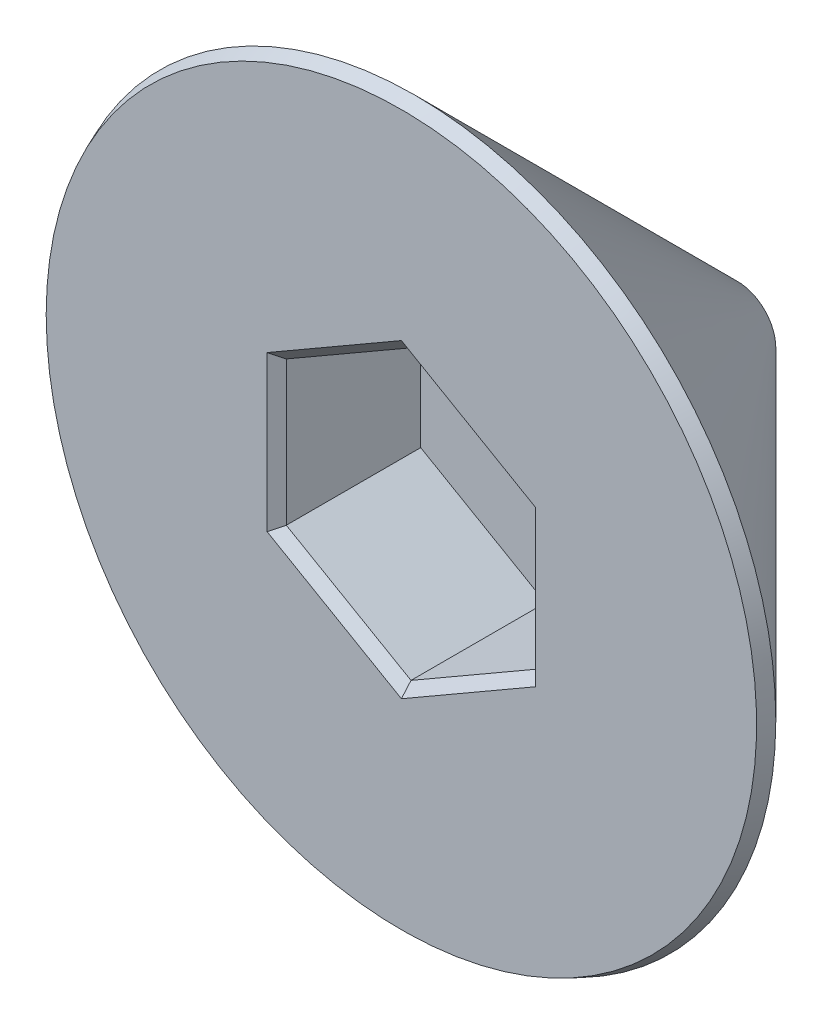
ISO-10303-21;
HEADER;
FILE_DESCRIPTION(('STEP AP214'),'2;1');
FILE_NAME('part.step','',(''),(''),'','','');
FILE_SCHEMA(('AUTOMOTIVE_DESIGN { 1 0 10303 214 1 1 1 1 }'));
ENDSEC;
DATA;
#1=APPLICATION_CONTEXT('core data for automotive mechanical design processes');
#2=APPLICATION_PROTOCOL_DEFINITION('international standard','automotive_design',2000,#1);
#3=PRODUCT_CONTEXT('',#1,'mechanical');
#4=PRODUCT('Part','Part','',(#3));
#5=PRODUCT_RELATED_PRODUCT_CATEGORY('part','',(#4));
#6=PRODUCT_DEFINITION_FORMATION('','',#4);
#7=PRODUCT_DEFINITION_CONTEXT('part definition',#1,'design');
#8=PRODUCT_DEFINITION('design','',#6,#7);
#9=PRODUCT_DEFINITION_SHAPE('','',#8);
#10=(LENGTH_UNIT() NAMED_UNIT(*) SI_UNIT(.MILLI.,.METRE.));
#11=(NAMED_UNIT(*) PLANE_ANGLE_UNIT() SI_UNIT($,.RADIAN.));
#12=(NAMED_UNIT(*) SI_UNIT($,.STERADIAN.) SOLID_ANGLE_UNIT());
#13=UNCERTAINTY_MEASURE_WITH_UNIT(LENGTH_MEASURE(1.E-05),#10,'distance_accuracy_value','');
#14=(GEOMETRIC_REPRESENTATION_CONTEXT(3) GLOBAL_UNCERTAINTY_ASSIGNED_CONTEXT((#13)) GLOBAL_UNIT_ASSIGNED_CONTEXT((#10,
#11,#12)) REPRESENTATION_CONTEXT('',''));
#15=CARTESIAN_POINT('',(0.,0.,0.));
#16=DIRECTION('',(0.,0.,1.));
#17=DIRECTION('',(1.,0.,0.));
#18=AXIS2_PLACEMENT_3D('',#15,#16,#17);
#19=CARTESIAN_POINT('',(-7.5,-14.4903810567666,66.5));
#20=DIRECTION('',(0.,0.,-1.));
#21=DIRECTION('',(-1.,0.,0.));
#22=AXIS2_PLACEMENT_3D('',#19,#20,#21);
#23=PLANE('',#22);
#24=DIRECTION('',(0.,1.,0.));
#25=VECTOR('',#24,1.);
#26=CARTESIAN_POINT('',(-6.20096189432331,-13.7403810567666,66.5));
#27=LINE('',#26,#25);
#28=CARTESIAN_POINT('',(-6.20096189432332,-13.7403810567666,66.5));
#29=VERTEX_POINT('',#28);
#30=CARTESIAN_POINT('',(-6.20096189432331,-12.2403810567666,66.5));
#31=VERTEX_POINT('',#30);
#32=EDGE_CURVE('E172',#29,#31,#27,.T.);
#33=ORIENTED_EDGE('',*,*,#32,.T.);
#34=DIRECTION('',(-0.866025403784439,0.5,0.));
#35=VECTOR('',#34,1.);
#36=CARTESIAN_POINT('',(-6.20096189432331,-12.2403810567666,66.5));
#37=LINE('',#36,#35);
#38=CARTESIAN_POINT('',(-7.5,-11.4903810567666,66.5));
#39=VERTEX_POINT('',#38);
#40=EDGE_CURVE('E177',#31,#39,#37,.T.);
#41=ORIENTED_EDGE('',*,*,#40,.T.);
#42=DIRECTION('',(-0.866025403784439,-0.5,0.));
#43=VECTOR('',#42,1.);
#44=CARTESIAN_POINT('',(-7.5,-11.4903810567666,66.5));
#45=LINE('',#44,#43);
#46=CARTESIAN_POINT('',(-8.79903810567658,-12.2403810567666,66.5));
#47=VERTEX_POINT('',#46);
#48=EDGE_CURVE('E181',#39,#47,#45,.T.);
#49=ORIENTED_EDGE('',*,*,#48,.T.);
#50=DIRECTION('',(0.,-1.,0.));
#51=VECTOR('',#50,1.);
#52=CARTESIAN_POINT('',(-8.79903810567657,-12.2403810567666,66.5));
#53=LINE('',#52,#51);
#54=CARTESIAN_POINT('',(-8.79903810567657,-13.7403810567666,66.5));
#55=VERTEX_POINT('',#54);
#56=EDGE_CURVE('E86',#47,#55,#53,.T.);
#57=ORIENTED_EDGE('',*,*,#56,.T.);
#58=DIRECTION('',(0.866025403784439,-0.5,0.));
#59=VECTOR('',#58,1.);
#60=CARTESIAN_POINT('',(-8.79903810567657,-13.7403810567666,66.5));
#61=LINE('',#60,#59);
#62=CARTESIAN_POINT('',(-7.5,-14.4903810567666,66.5));
#63=VERTEX_POINT('',#62);
#64=EDGE_CURVE('E88',#55,#63,#61,.T.);
#65=ORIENTED_EDGE('',*,*,#64,.T.);
#66=DIRECTION('',(0.866025403784439,0.5,0.));
#67=VECTOR('',#66,1.);
#68=CARTESIAN_POINT('',(-7.5,-14.4903810567666,66.5));
#69=LINE('',#68,#67);
#70=EDGE_CURVE('E90',#63,#29,#69,.T.);
#71=ORIENTED_EDGE('',*,*,#70,.T.);
#72=EDGE_LOOP('',(#33,#41,#49,#57,#65,#71));
#73=FACE_BOUND('',#72,.T.);
#74=ADVANCED_FACE('F17',(#73),#23,.F.);
#75=CARTESIAN_POINT('',(-7.5,-14.4903810567666,68.));
#76=DIRECTION('',(0.5,-0.866025403784439,0.));
#77=DIRECTION('',(0.866025403784439,0.5,0.));
#78=AXIS2_PLACEMENT_3D('',#75,#76,#77);
#79=PLANE('',#78);
#80=DIRECTION('',(0.,0.,1.));
#81=VECTOR('',#80,1.);
#82=CARTESIAN_POINT('',(-6.20096189432331,-13.7403810567666,68.));
#83=LINE('',#82,#81);
#84=CARTESIAN_POINT('',(-6.20096189432331,-13.7403810567666,67.9));
#85=VERTEX_POINT('',#84);
#86=EDGE_CURVE('E101',#85,#29,#83,.F.);
#87=ORIENTED_EDGE('',*,*,#86,.T.);
#88=ORIENTED_EDGE('',*,*,#70,.F.);
#89=DIRECTION('',(0.,0.,1.));
#90=VECTOR('',#89,1.);
#91=CARTESIAN_POINT('',(-7.5,-14.4903810567666,68.));
#92=LINE('',#91,#90);
#93=CARTESIAN_POINT('',(-7.5,-14.4903810567666,67.9));
#94=VERTEX_POINT('',#93);
#95=EDGE_CURVE('E95',#63,#94,#92,.T.);
#96=ORIENTED_EDGE('',*,*,#95,.T.);
#97=DIRECTION('',(-0.86602540378444,-0.5,0.));
#98=VECTOR('',#97,1.);
#99=CARTESIAN_POINT('',(-6.2009618943233,-13.7403810567666,67.9));
#100=LINE('',#99,#98);
#101=EDGE_CURVE('E168',#85,#94,#100,.T.);
#102=ORIENTED_EDGE('',*,*,#101,.F.);
#103=EDGE_LOOP('',(#87,#88,#96,#102));
#104=FACE_BOUND('',#103,.T.);
#105=ADVANCED_FACE('F98',(#104),#79,.F.);
#106=CARTESIAN_POINT('',(-8.79903810567657,-13.7403810567666,68.));
#107=DIRECTION('',(-0.5,-0.866025403784439,0.));
#108=DIRECTION('',(0.866025403784439,-0.5,0.));
#109=AXIS2_PLACEMENT_3D('',#106,#107,#108);
#110=PLANE('',#109);
#111=ORIENTED_EDGE('',*,*,#95,.F.);
#112=ORIENTED_EDGE('',*,*,#64,.F.);
#113=DIRECTION('',(0.,0.,1.));
#114=VECTOR('',#113,1.);
#115=CARTESIAN_POINT('',(-8.79903810567657,-13.7403810567666,68.));
#116=LINE('',#115,#114);
#117=CARTESIAN_POINT('',(-8.79903810567658,-13.7403810567666,67.9));
#118=VERTEX_POINT('',#117);
#119=EDGE_CURVE('E110',#55,#118,#116,.T.);
#120=ORIENTED_EDGE('',*,*,#119,.T.);
#121=DIRECTION('',(-0.866025403784433,0.50000000000001,0.));
#122=VECTOR('',#121,1.);
#123=CARTESIAN_POINT('',(-7.5,-14.4903810567666,67.9));
#124=LINE('',#123,#122);
#125=EDGE_CURVE('E107',#94,#118,#124,.T.);
#126=ORIENTED_EDGE('',*,*,#125,.F.);
#127=EDGE_LOOP('',(#111,#112,#120,#126));
#128=FACE_BOUND('',#127,.T.);
#129=ADVANCED_FACE('F105',(#128),#110,.F.);
#130=CARTESIAN_POINT('',(-8.79903810567657,-12.2403810567666,68.));
#131=DIRECTION('',(-1.,0.,0.));
#132=DIRECTION('',(0.,-1.,0.));
#133=AXIS2_PLACEMENT_3D('',#130,#131,#132);
#134=PLANE('',#133);
#135=ORIENTED_EDGE('',*,*,#119,.F.);
#136=ORIENTED_EDGE('',*,*,#56,.F.);
#137=DIRECTION('',(0.,0.,1.));
#138=VECTOR('',#137,1.);
#139=CARTESIAN_POINT('',(-8.79903810567659,-12.2403810567666,68.));
#140=LINE('',#139,#138);
#141=CARTESIAN_POINT('',(-8.79903810567658,-12.2403810567666,67.9));
#142=VERTEX_POINT('',#141);
#143=EDGE_CURVE('E179',#47,#142,#140,.T.);
#144=ORIENTED_EDGE('',*,*,#143,.T.);
#145=DIRECTION('',(0.,1.,0.));
#146=VECTOR('',#145,1.);
#147=CARTESIAN_POINT('',(-8.79903810567661,-12.6153810567666,67.9));
#148=LINE('',#147,#146);
#149=EDGE_CURVE('E159',#118,#142,#148,.T.);
#150=ORIENTED_EDGE('',*,*,#149,.F.);
#151=EDGE_LOOP('',(#135,#136,#144,#150));
#152=FACE_BOUND('',#151,.T.);
#153=ADVANCED_FACE('F188',(#152),#134,.F.);
#154=CARTESIAN_POINT('',(-7.5,-11.4903810567666,68.));
#155=DIRECTION('',(-0.5,0.866025403784439,0.));
#156=DIRECTION('',(-0.866025403784439,-0.5,0.));
#157=AXIS2_PLACEMENT_3D('',#154,#155,#156);
#158=PLANE('',#157);
#159=ORIENTED_EDGE('',*,*,#143,.F.);
#160=ORIENTED_EDGE('',*,*,#48,.F.);
#161=DIRECTION('',(0.,0.,1.));
#162=VECTOR('',#161,1.);
#163=CARTESIAN_POINT('',(-7.5,-11.4903810567666,68.));
#164=LINE('',#163,#162);
#165=CARTESIAN_POINT('',(-7.5,-11.4903810567666,67.9));
#166=VERTEX_POINT('',#165);
#167=EDGE_CURVE('E175',#39,#166,#164,.T.);
#168=ORIENTED_EDGE('',*,*,#167,.T.);
#169=DIRECTION('',(0.86602540378443,0.500000000000014,0.));
#170=VECTOR('',#169,1.);
#171=CARTESIAN_POINT('',(-8.79903810567658,-12.2403810567666,67.9));
#172=LINE('',#171,#170);
#173=EDGE_CURVE('E153',#142,#166,#172,.T.);
#174=ORIENTED_EDGE('',*,*,#173,.F.);
#175=EDGE_LOOP('',(#159,#160,#168,#174));
#176=FACE_BOUND('',#175,.T.);
#177=ADVANCED_FACE('F212',(#176),#158,.F.);
#178=CARTESIAN_POINT('',(-6.20096189432331,-12.2403810567666,68.));
#179=DIRECTION('',(0.5,0.866025403784439,0.));
#180=DIRECTION('',(-0.866025403784439,0.5,0.));
#181=AXIS2_PLACEMENT_3D('',#178,#179,#180);
#182=PLANE('',#181);
#183=ORIENTED_EDGE('',*,*,#167,.F.);
#184=ORIENTED_EDGE('',*,*,#40,.F.);
#185=DIRECTION('',(0.,0.,1.));
#186=VECTOR('',#185,1.);
#187=CARTESIAN_POINT('',(-6.20096189432331,-12.2403810567666,68.));
#188=LINE('',#187,#186);
#189=CARTESIAN_POINT('',(-6.20096189432331,-12.2403810567666,67.9));
#190=VERTEX_POINT('',#189);
#191=EDGE_CURVE('E170',#31,#190,#188,.T.);
#192=ORIENTED_EDGE('',*,*,#191,.T.);
#193=DIRECTION('',(0.866025403784442,-0.499999999999994,0.));
#194=VECTOR('',#193,1.);
#195=CARTESIAN_POINT('',(-7.5,-11.4903810567666,67.9));
#196=LINE('',#195,#194);
#197=EDGE_CURVE('E148',#166,#190,#196,.T.);
#198=ORIENTED_EDGE('',*,*,#197,.F.);
#199=EDGE_LOOP('',(#183,#184,#192,#198));
#200=FACE_BOUND('',#199,.T.);
#201=ADVANCED_FACE('F209',(#200),#182,.F.);
#202=CARTESIAN_POINT('',(-6.20096189432331,-13.7403810567666,68.));
#203=DIRECTION('',(1.,0.,0.));
#204=DIRECTION('',(0.,1.,0.));
#205=AXIS2_PLACEMENT_3D('',#202,#203,#204);
#206=PLANE('',#205);
#207=ORIENTED_EDGE('',*,*,#191,.F.);
#208=ORIENTED_EDGE('',*,*,#32,.F.);
#209=ORIENTED_EDGE('',*,*,#86,.F.);
#210=DIRECTION('',(0.,1.,0.));
#211=VECTOR('',#210,1.);
#212=CARTESIAN_POINT('',(-6.20096189432328,-13.3653810567666,67.9));
#213=LINE('',#212,#211);
#214=EDGE_CURVE('E144',#190,#85,#213,.F.);
#215=ORIENTED_EDGE('',*,*,#214,.F.);
#216=EDGE_LOOP('',(#207,#208,#209,#215));
#217=FACE_BOUND('',#216,.T.);
#218=ADVANCED_FACE('F204',(#217),#206,.F.);
#219=CARTESIAN_POINT('',(-7.15024047358077,-14.3461823269558,67.95));
#220=DIRECTION('',(-0.353553390593344,0.612372435695916,0.707106781186407));
#221=DIRECTION('',(0.,-0.755928946018326,0.654653670708126));
#222=AXIS2_PLACEMENT_3D('',#219,#220,#221);
#223=PLANE('',#222);
#224=ORIENTED_EDGE('',*,*,#101,.T.);
#225=DIRECTION('',(0.,-0.755928946018315,0.654653670708139));
#226=VECTOR('',#225,1.);
#227=CARTESIAN_POINT('',(-7.5,-14.2184396512686,67.6644918344979));
#228=LINE('',#227,#226);
#229=CARTESIAN_POINT('',(-7.5,-14.6058511106044,68.));
#230=VERTEX_POINT('',#229);
#231=EDGE_CURVE('E166',#230,#94,#228,.F.);
#232=ORIENTED_EDGE('',*,*,#231,.F.);
#233=DIRECTION('',(-0.86602540378449,-0.499999999999911,0.));
#234=VECTOR('',#233,1.);
#235=CARTESIAN_POINT('',(-6.10096189432329,-13.7981160836856,68.));
#236=LINE('',#235,#234);
#237=CARTESIAN_POINT('',(-6.10096189432329,-13.7981160836856,68.));
#238=VERTEX_POINT('',#237);
#239=EDGE_CURVE('E139',#238,#230,#236,.T.);
#240=ORIENTED_EDGE('',*,*,#239,.F.);
#241=DIRECTION('',(0.654653670707936,-0.37796447300942,0.654653670707908));
#242=VECTOR('',#241,1.);
#243=CARTESIAN_POINT('',(-6.20096189432328,-13.7403810567666,67.9));
#244=LINE('',#243,#242);
#245=EDGE_CURVE('E141',#85,#238,#244,.T.);
#246=ORIENTED_EDGE('',*,*,#245,.F.);
#247=EDGE_LOOP('',(#224,#232,#240,#246));
#248=FACE_BOUND('',#247,.T.);
#249=ADVANCED_FACE('F198',(#248),#223,.T.);
#250=CARTESIAN_POINT('',(-8.49927857925741,-13.9711823269558,67.95));
#251=DIRECTION('',(0.35355339059335,0.612372435695927,0.707106781186395));
#252=DIRECTION('',(0.,-0.755928946018315,0.654653670708139));
#253=AXIS2_PLACEMENT_3D('',#250,#251,#252);
#254=PLANE('',#253);
#255=ORIENTED_EDGE('',*,*,#125,.T.);
#256=DIRECTION('',(0.654653670708093,0.377964473008827,-0.654653670708093));
#257=VECTOR('',#256,1.);
#258=CARTESIAN_POINT('',(-8.89903810567662,-13.7981160836855,68.));
#259=LINE('',#258,#257);
#260=CARTESIAN_POINT('',(-8.89903810567661,-13.7981160836855,68.));
#261=VERTEX_POINT('',#260);
#262=EDGE_CURVE('E162',#261,#118,#259,.T.);
#263=ORIENTED_EDGE('',*,*,#262,.F.);
#264=DIRECTION('',(-0.866025403784446,0.499999999999987,0.));
#265=VECTOR('',#264,1.);
#266=CARTESIAN_POINT('',(-7.5,-14.6058511106044,68.));
#267=LINE('',#266,#265);
#268=EDGE_CURVE('E136',#230,#261,#267,.T.);
#269=ORIENTED_EDGE('',*,*,#268,.F.);
#270=ORIENTED_EDGE('',*,*,#231,.T.);
#271=EDGE_LOOP('',(#255,#263,#269,#270));
#272=FACE_BOUND('',#271,.T.);
#273=ADVANCED_FACE('F185',(#272),#254,.T.);
#274=CARTESIAN_POINT('',(-8.84903810567664,-12.6153810567666,67.95));
#275=DIRECTION('',(0.707106781186543,0.,0.707106781186553));
#276=DIRECTION('',(0.707106781186553,0.,-0.707106781186543));
#277=AXIS2_PLACEMENT_3D('',#274,#275,#276);
#278=PLANE('',#277);
#279=ORIENTED_EDGE('',*,*,#149,.T.);
#280=DIRECTION('',(0.65465367070818,-0.37796447300882,-0.65465367070801));
#281=VECTOR('',#280,1.);
#282=CARTESIAN_POINT('',(-8.89903810567661,-12.1826460298477,68.));
#283=LINE('',#282,#281);
#284=CARTESIAN_POINT('',(-8.89903810567661,-12.1826460298477,68.));
#285=VERTEX_POINT('',#284);
#286=EDGE_CURVE('E156',#285,#142,#283,.T.);
#287=ORIENTED_EDGE('',*,*,#286,.F.);
#288=DIRECTION('',(0.,1.,0.));
#289=VECTOR('',#288,1.);
#290=CARTESIAN_POINT('',(-8.8990381056766,-12.9903810567667,68.));
#291=LINE('',#290,#289);
#292=EDGE_CURVE('E133',#261,#285,#291,.T.);
#293=ORIENTED_EDGE('',*,*,#292,.F.);
#294=ORIENTED_EDGE('',*,*,#262,.T.);
#295=EDGE_LOOP('',(#279,#287,#293,#294));
#296=FACE_BOUND('',#295,.T.);
#297=ADVANCED_FACE('F192',(#296),#278,.T.);
#298=CARTESIAN_POINT('',(-7.84975952641912,-11.6345797865774,67.95));
#299=DIRECTION('',(0.35355339059335,-0.612372435695927,0.707106781186395));
#300=DIRECTION('',(0.,-0.755928946018315,-0.654653670708139));
#301=AXIS2_PLACEMENT_3D('',#298,#299,#300);
#302=PLANE('',#301);
#303=ORIENTED_EDGE('',*,*,#173,.T.);
#304=DIRECTION('',(0.,-0.755928946018326,-0.654653670708126));
#305=VECTOR('',#304,1.);
#306=CARTESIAN_POINT('',(-7.5,-11.7623224622645,67.6644918344978));
#307=LINE('',#306,#305);
#308=CARTESIAN_POINT('',(-7.5,-11.3749110029287,68.));
#309=VERTEX_POINT('',#308);
#310=EDGE_CURVE('E150',#309,#166,#307,.T.);
#311=ORIENTED_EDGE('',*,*,#310,.F.);
#312=DIRECTION('',(0.86602540378442,0.500000000000033,0.));
#313=VECTOR('',#312,1.);
#314=CARTESIAN_POINT('',(-8.8990381056766,-12.1826460298477,68.));
#315=LINE('',#314,#313);
#316=EDGE_CURVE('E126',#285,#309,#315,.T.);
#317=ORIENTED_EDGE('',*,*,#316,.F.);
#318=ORIENTED_EDGE('',*,*,#286,.T.);
#319=EDGE_LOOP('',(#303,#311,#317,#318));
#320=FACE_BOUND('',#319,.T.);
#321=ADVANCED_FACE('F214',(#320),#302,.T.);
#322=CARTESIAN_POINT('',(-6.50072142074248,-12.0095797865774,67.95));
#323=DIRECTION('',(-0.353553390593344,-0.612372435695916,0.707106781186407));
#324=DIRECTION('',(0.,-0.755928946018326,-0.654653670708126));
#325=AXIS2_PLACEMENT_3D('',#322,#323,#324);
#326=PLANE('',#325);
#327=ORIENTED_EDGE('',*,*,#197,.T.);
#328=DIRECTION('',(-0.654653670707936,-0.37796447300942,-0.654653670707908));
#329=VECTOR('',#328,1.);
#330=CARTESIAN_POINT('',(-6.10096189432327,-12.1826460298476,68.));
#331=LINE('',#330,#329);
#332=CARTESIAN_POINT('',(-6.10096189432329,-12.1826460298476,68.));
#333=VERTEX_POINT('',#332);
#334=EDGE_CURVE('E35',#333,#190,#331,.T.);
#335=ORIENTED_EDGE('',*,*,#334,.F.);
#336=DIRECTION('',(0.866025403784464,-0.499999999999957,0.));
#337=VECTOR('',#336,1.);
#338=CARTESIAN_POINT('',(-7.5,-11.3749110029287,68.));
#339=LINE('',#338,#337);
#340=EDGE_CURVE('E121',#309,#333,#339,.T.);
#341=ORIENTED_EDGE('',*,*,#340,.F.);
#342=ORIENTED_EDGE('',*,*,#310,.T.);
#343=EDGE_LOOP('',(#327,#335,#341,#342));
#344=FACE_BOUND('',#343,.T.);
#345=ADVANCED_FACE('F215',(#344),#326,.T.);
#346=CARTESIAN_POINT('',(-6.15096189432325,-13.3653810567666,67.95));
#347=DIRECTION('',(-0.707106781186543,0.,0.707106781186553));
#348=DIRECTION('',(0.707106781186553,0.,0.707106781186543));
#349=AXIS2_PLACEMENT_3D('',#346,#347,#348);
#350=PLANE('',#349);
#351=ORIENTED_EDGE('',*,*,#214,.T.);
#352=ORIENTED_EDGE('',*,*,#245,.T.);
#353=DIRECTION('',(0.,1.,0.));
#354=VECTOR('',#353,1.);
#355=CARTESIAN_POINT('',(-6.10096189432329,-12.9903810567667,68.));
#356=LINE('',#355,#354);
#357=EDGE_CURVE('E117',#333,#238,#356,.F.);
#358=ORIENTED_EDGE('',*,*,#357,.F.);
#359=ORIENTED_EDGE('',*,*,#334,.T.);
#360=EDGE_LOOP('',(#351,#352,#358,#359));
#361=FACE_BOUND('',#360,.T.);
#362=ADVANCED_FACE('F200',(#361),#350,.T.);
#363=CARTESIAN_POINT('',(-7.49999999999989,-12.9903810567667,68.));
#364=DIRECTION('',(0.,0.,1.));
#365=DIRECTION('',(1.,0.,0.));
#366=AXIS2_PLACEMENT_3D('',#363,#364,#365);
#367=PLANE('',#366);
#368=ORIENTED_EDGE('',*,*,#340,.T.);
#369=ORIENTED_EDGE('',*,*,#357,.T.);
#370=ORIENTED_EDGE('',*,*,#239,.T.);
#371=ORIENTED_EDGE('',*,*,#268,.T.);
#372=ORIENTED_EDGE('',*,*,#292,.T.);
#373=ORIENTED_EDGE('',*,*,#316,.T.);
#374=EDGE_LOOP('',(#368,#369,#370,#371,#372,#373));
#375=FACE_BOUND('',#374,.T.);
#376=CARTESIAN_POINT('',(-7.5,-12.9903810567666,67.9999999999836));
#377=DIRECTION('',(0.,0.,-1.));
#378=DIRECTION('',(-1.,0.,0.));
#379=AXIS2_PLACEMENT_3D('',#376,#377,#378);
#380=CIRCLE('',#379,3.69999999996148);
#381=CARTESIAN_POINT('',(-11.1999999999615,-12.9903810567666,67.9999999999832));
#382=VERTEX_POINT('',#381);
#383=EDGE_CURVE('E20',#382,#382,#380,.T.);
#384=ORIENTED_EDGE('',*,*,#383,.F.);
#385=EDGE_LOOP('',(#384));
#386=FACE_BOUND('',#385,.T.);
#387=ADVANCED_FACE('F194',(#375,#386),#367,.T.);
#388=CARTESIAN_POINT('',(-7.5,-9.09038105676661,64.5));
#389=DIRECTION('',(0.,0.,1.));
#390=DIRECTION('',(1.,0.,0.));
#391=AXIS2_PLACEMENT_3D('',#388,#389,#390);
#392=PLANE('',#391);
#393=CARTESIAN_POINT('',(-7.5,-12.9903810567666,64.5000000000096));
#394=DIRECTION('',(0.,0.,1.));
#395=DIRECTION('',(1.,0.,0.));
#396=AXIS2_PLACEMENT_3D('',#393,#394,#395);
#397=CIRCLE('',#396,0.400000000041438);
#398=CARTESIAN_POINT('',(-7.09999999995849,-12.9903810567666,64.5000000000096));
#399=VERTEX_POINT('',#398);
#400=EDGE_CURVE('E26',#399,#399,#397,.T.);
#401=ORIENTED_EDGE('',*,*,#400,.F.);
#402=EDGE_LOOP('',(#401));
#403=FACE_BOUND('',#402,.T.);
#404=ADVANCED_FACE('F235',(#403),#392,.F.);
#405=CARTESIAN_POINT('',(-7.5,-12.9903810567666,67.8585786438362));
#406=DIRECTION('',(0.,0.,-1.));
#407=DIRECTION('',(-1.,0.,0.));
#408=AXIS2_PLACEMENT_3D('',#405,#406,#407);
#409=CONICAL_SURFACE('',#408,3.75857864369804,0.392699081765604);
#410=ORIENTED_EDGE('',*,*,#383,.T.);
#411=EDGE_LOOP('',(#410));
#412=FACE_BOUND('',#411,.T.);
#413=CARTESIAN_POINT('',(-7.5,-12.9903810567666,67.8585786437225));
#414=DIRECTION('',(0.,0.,1.));
#415=DIRECTION('',(0.,1.,0.));
#416=AXIS2_PLACEMENT_3D('',#413,#414,#415);
#417=CIRCLE('',#416,3.75857864375435);
#418=CARTESIAN_POINT('',(-3.7414213562456,-12.9903810567666,67.8585786437225));
#419=VERTEX_POINT('',#418);
#420=EDGE_CURVE('E11',#419,#419,#417,.F.);
#421=ORIENTED_EDGE('',*,*,#420,.F.);
#422=EDGE_LOOP('',(#421));
#423=FACE_BOUND('',#422,.T.);
#424=ADVANCED_FACE('F228',(#412,#423),#409,.T.);
#425=CARTESIAN_POINT('',(-7.5,-12.9903810567666,67.8585786436656));
#426=DIRECTION('',(0.,0.,1.));
#427=DIRECTION('',(1.,0.,0.));
#428=AXIS2_PLACEMENT_3D('',#425,#426,#427);
#429=CONICAL_SURFACE('',#428,3.75857864369751,0.785398163397448);
#430=CARTESIAN_POINT('',(-3.7414213562456,-12.9903810567666,67.8585786437225));
#431=CARTESIAN_POINT('',(-3.77640655045094,-12.9903810567666,67.8235934495171));
#432=CARTESIAN_POINT('',(-3.81139174465628,-12.9903810567666,67.7886082553118));
#433=CARTESIAN_POINT('',(-3.88136213306697,-12.9903810567666,67.7186378669011));
#434=CARTESIAN_POINT('',(-3.91634732727231,-12.9903810567666,67.6836526726958));
#435=CARTESIAN_POINT('',(-3.986317715683,-12.9903810567666,67.6136822842851));
#436=CARTESIAN_POINT('',(-4.02130290988834,-12.9903810567666,67.5786970900798));
#437=CARTESIAN_POINT('',(-4.09127329829902,-12.9903810567666,67.5087267016691));
#438=CARTESIAN_POINT('',(-4.12625849250437,-12.9903810567666,67.4737415074637));
#439=CARTESIAN_POINT('',(-4.19622888091505,-12.9903810567666,67.403771119053));
#440=CARTESIAN_POINT('',(-4.23121407512039,-12.9903810567666,67.3687859248477));
#441=CARTESIAN_POINT('',(-4.30118446353108,-12.9903810567666,67.298815536437));
#442=CARTESIAN_POINT('',(-4.33616965773642,-12.9903810567666,67.2638303422317));
#443=CARTESIAN_POINT('',(-4.40614004614711,-12.9903810567666,67.193859953821));
#444=CARTESIAN_POINT('',(-4.44112524035245,-12.9903810567666,67.1588747596156));
#445=CARTESIAN_POINT('',(-4.51109562876313,-12.9903810567666,67.0889043712049));
#446=CARTESIAN_POINT('',(-4.54608082296848,-12.9903810567666,67.0539191769996));
#447=CARTESIAN_POINT('',(-4.61605121137916,-12.9903810567666,66.9839487885889));
#448=CARTESIAN_POINT('',(-4.65103640558451,-12.9903810567666,66.9489635943836));
#449=CARTESIAN_POINT('',(-4.72100679399519,-12.9903810567666,66.8789932059729));
#450=CARTESIAN_POINT('',(-4.75599198820053,-12.9903810567666,66.8440080117676));
#451=CARTESIAN_POINT('',(-4.82596237661122,-12.9903810567666,66.7740376233569));
#452=CARTESIAN_POINT('',(-4.86094757081656,-12.9903810567666,66.7390524291515));
#453=CARTESIAN_POINT('',(-4.93091795922725,-12.9903810567666,66.6690820407408));
#454=CARTESIAN_POINT('',(-4.96590315343259,-12.9903810567666,66.6340968465355));
#455=CARTESIAN_POINT('',(-5.03587354184327,-12.9903810567666,66.5641264581248));
#456=CARTESIAN_POINT('',(-5.07085873604862,-12.9903810567666,66.5291412639195));
#457=CARTESIAN_POINT('',(-5.1408291244593,-12.9903810567666,66.4591708755088));
#458=CARTESIAN_POINT('',(-5.17581431866464,-12.9903810567666,66.4241856813034));
#459=CARTESIAN_POINT('',(-5.24578470707533,-12.9903810567666,66.3542152928927));
#460=CARTESIAN_POINT('',(-5.28076990128067,-12.9903810567666,66.3192300986874));
#461=CARTESIAN_POINT('',(-5.35074028969136,-12.9903810567666,66.2492597102767));
#462=CARTESIAN_POINT('',(-5.3857254838967,-12.9903810567666,66.2142745160714));
#463=CARTESIAN_POINT('',(-5.45569587230738,-12.9903810567666,66.1443041276607));
#464=CARTESIAN_POINT('',(-5.49068106651273,-12.9903810567666,66.1093189334554));
#465=CARTESIAN_POINT('',(-5.56065145492341,-12.9903810567666,66.0393485450447));
#466=CARTESIAN_POINT('',(-5.59563664912876,-12.9903810567666,66.0043633508393));
#467=CARTESIAN_POINT('',(-5.66560703753944,-12.9903810567666,65.9343929624286));
#468=CARTESIAN_POINT('',(-5.70059223174478,-12.9903810567666,65.8994077682233));
#469=CARTESIAN_POINT('',(-5.77056262015547,-12.9903810567666,65.8294373798126));
#470=CARTESIAN_POINT('',(-5.80554781436081,-12.9903810567666,65.7944521856073));
#471=CARTESIAN_POINT('',(-5.8755182027715,-12.9903810567666,65.7244817971966));
#472=CARTESIAN_POINT('',(-5.91050339697684,-12.9903810567666,65.6894966029913));
#473=CARTESIAN_POINT('',(-5.98047378538752,-12.9903810567666,65.6195262145806));
#474=CARTESIAN_POINT('',(-6.01545897959287,-12.9903810567666,65.5845410203752));
#475=CARTESIAN_POINT('',(-6.08542936800355,-12.9903810567666,65.5145706319645));
#476=CARTESIAN_POINT('',(-6.12041456220889,-12.9903810567666,65.4795854377592));
#477=CARTESIAN_POINT('',(-6.19038495061958,-12.9903810567666,65.4096150493485));
#478=CARTESIAN_POINT('',(-6.22537014482492,-12.9903810567666,65.3746298551432));
#479=CARTESIAN_POINT('',(-6.29534053323561,-12.9903810567666,65.3046594667325));
#480=CARTESIAN_POINT('',(-6.33032572744095,-12.9903810567666,65.2696742725271));
#481=CARTESIAN_POINT('',(-6.40029611585163,-12.9903810567666,65.1997038841164));
#482=CARTESIAN_POINT('',(-6.43528131005698,-12.9903810567666,65.1647186899111));
#483=CARTESIAN_POINT('',(-6.50525169846766,-12.9903810567666,65.0947483015004));
#484=CARTESIAN_POINT('',(-6.54023689267301,-12.9903810567666,65.0597631072951));
#485=CARTESIAN_POINT('',(-6.61020728108369,-12.9903810567666,64.9897927188844));
#486=CARTESIAN_POINT('',(-6.64519247528903,-12.9903810567666,64.9548075246791));
#487=CARTESIAN_POINT('',(-6.71516286369972,-12.9903810567666,64.8848371362684));
#488=CARTESIAN_POINT('',(-6.75014805790506,-12.9903810567666,64.849851942063));
#489=CARTESIAN_POINT('',(-6.82011844631575,-12.9903810567666,64.7798815536523));
#490=CARTESIAN_POINT('',(-6.85510364052109,-12.9903810567666,64.744896359447));
#491=CARTESIAN_POINT('',(-6.92507402893177,-12.9903810567666,64.6749259710363));
#492=CARTESIAN_POINT('',(-6.96005922313712,-12.9903810567666,64.639940776831));
#493=CARTESIAN_POINT('',(-7.0300296115478,-12.9903810567666,64.5699703884203));
#494=CARTESIAN_POINT('',(-7.06501480575314,-12.9903810567666,64.5349851942149));
#495=CARTESIAN_POINT('',(-7.09999999995849,-12.9903810567666,64.5000000000096));
#496=B_SPLINE_CURVE_WITH_KNOTS('',3,(#430,#431,#432,#433,#434,#435,#436,#437,#438,#439,#440,
#441,#442,#443,#444,#445,#446,#447,#448,#449,#450,#451,#452,#453,#454,#455,#456,#457,#458,#459,
#460,#461,#462,#463,#464,#465,#466,#467,#468,#469,#470,#471,#472,#473,#474,#475,#476,#477,#478,
#479,#480,#481,#482,#483,#484,#485,#486,#487,#488,#489,#490,#491,#492,#493,#494,#495),
.UNSPECIFIED.,.F.,.F.,(4,2,2,2,2,2,2,2,2,2,2,2,2,2,2,2,2,2,2,2,2,2,2,2,2,2,2,2,2,2,2,2,4),(0.,
0.148429608382357,0.296859216764714,0.445288825147071,0.593718433529428,0.742148041911785,
0.890577650294141,1.0390072586765,1.18743686705886,1.33586647544121,1.48429608382357,
1.63272569220593,1.78115530058828,1.92958490897064,2.078014517353,2.22644412573535,
2.37487373411771,2.52330334250006,2.67173295088242,2.82016255926477,2.96859216764713,
3.11702177602949,3.26545138441184,3.4138809927942,3.56231060117656,3.71074020955892,
3.85916981794127,4.00759942632363,4.15602903470599,4.30445864308834,4.4528882514707,
4.60131785985306,4.7497474682354),.UNSPECIFIED.);
#497=EDGE_CURVE('BSEAM226',#419,#399,#496,.T.);
#498=ORIENTED_EDGE('',*,*,#420,.T.);
#499=ORIENTED_EDGE('',*,*,#400,.T.);
#500=ORIENTED_EDGE('',*,*,#497,.T.);
#501=ORIENTED_EDGE('',*,*,#497,.F.);
#502=EDGE_LOOP('',(#498,#500,#499,#501));
#503=FACE_BOUND('',#502,.T.);
#504=ADVANCED_FACE('F226',(#503),#429,.T.);
#505=CLOSED_SHELL('',(#74,#105,#129,#153,#177,#201,#218,#249,#273,#297,#321,#345,#362,#387,#404,
#424,#504));
#506=MANIFOLD_SOLID_BREP('B1',#505);
#507=ADVANCED_BREP_SHAPE_REPRESENTATION('',(#18,#506),#14);
#508=SHAPE_DEFINITION_REPRESENTATION(#9,#507);
ENDSEC;
END-ISO-10303-21;
